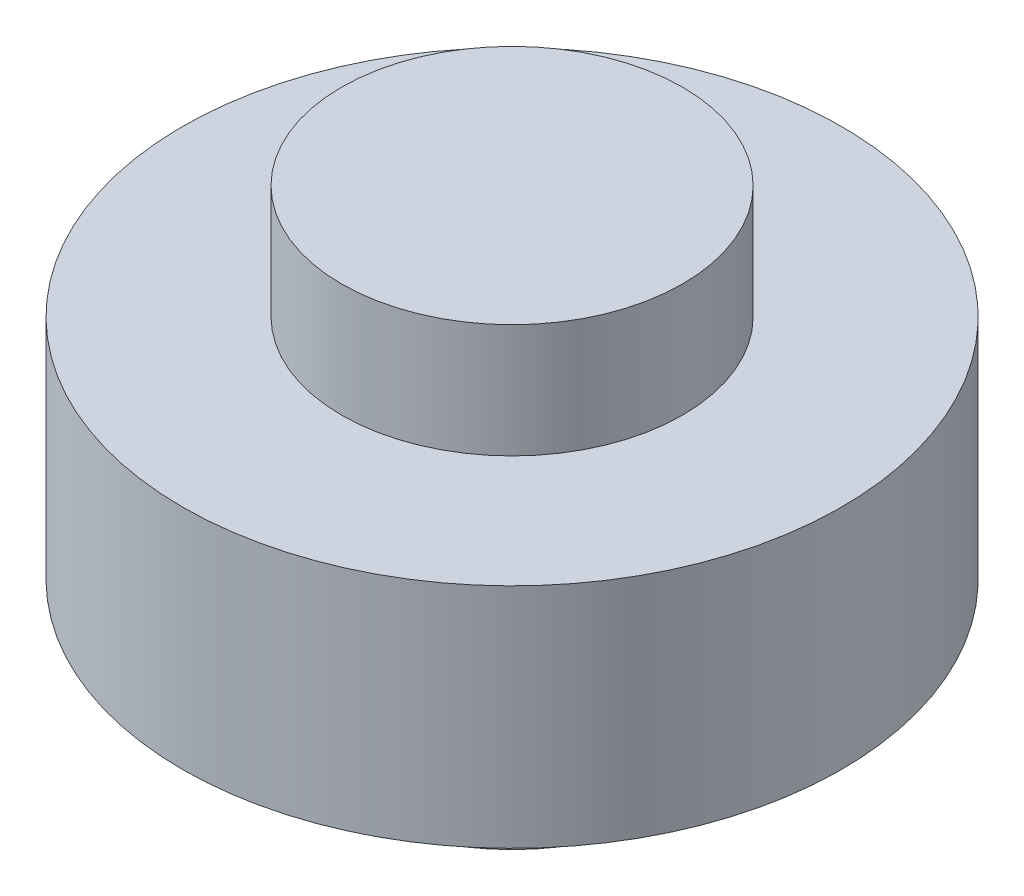
ISO-10303-21;
HEADER;
FILE_DESCRIPTION(('STEP AP214'),'2;1');
FILE_NAME('part.step','',(''),(''),'','','');
FILE_SCHEMA(('AUTOMOTIVE_DESIGN { 1 0 10303 214 1 1 1 1 }'));
ENDSEC;
DATA;
#1=APPLICATION_CONTEXT('core data for automotive mechanical design processes');
#2=APPLICATION_PROTOCOL_DEFINITION('international standard','automotive_design',2000,#1);
#3=PRODUCT_CONTEXT('',#1,'mechanical');
#4=PRODUCT('Part','Part','',(#3));
#5=PRODUCT_RELATED_PRODUCT_CATEGORY('part','',(#4));
#6=PRODUCT_DEFINITION_FORMATION('','',#4);
#7=PRODUCT_DEFINITION_CONTEXT('part definition',#1,'design');
#8=PRODUCT_DEFINITION('design','',#6,#7);
#9=PRODUCT_DEFINITION_SHAPE('','',#8);
#10=(LENGTH_UNIT() NAMED_UNIT(*) SI_UNIT(.MILLI.,.METRE.));
#11=(NAMED_UNIT(*) PLANE_ANGLE_UNIT() SI_UNIT($,.RADIAN.));
#12=(NAMED_UNIT(*) SI_UNIT($,.STERADIAN.) SOLID_ANGLE_UNIT());
#13=UNCERTAINTY_MEASURE_WITH_UNIT(LENGTH_MEASURE(1.E-05),#10,'distance_accuracy_value','');
#14=(GEOMETRIC_REPRESENTATION_CONTEXT(3) GLOBAL_UNCERTAINTY_ASSIGNED_CONTEXT((#13)) GLOBAL_UNIT_ASSIGNED_CONTEXT((#10,
#11,#12)) REPRESENTATION_CONTEXT('',''));
#15=CARTESIAN_POINT('',(0.,0.,0.));
#16=DIRECTION('',(0.,0.,1.));
#17=DIRECTION('',(1.,0.,0.));
#18=AXIS2_PLACEMENT_3D('',#15,#16,#17);
#19=CARTESIAN_POINT('',(0.,101.6,0.));
#20=DIRECTION('',(0.,1.,0.));
#21=DIRECTION('',(0.,0.,1.));
#22=AXIS2_PLACEMENT_3D('',#19,#20,#21);
#23=PLANE('',#22);
#24=CARTESIAN_POINT('',(0.,101.6,0.));
#25=DIRECTION('',(0.,1.,0.));
#26=DIRECTION('',(0.,0.,1.));
#27=AXIS2_PLACEMENT_3D('',#24,#25,#26);
#28=CIRCLE('',#27,76.2);
#29=CARTESIAN_POINT('',(0.,101.6,76.2));
#30=VERTEX_POINT('',#29);
#31=EDGE_CURVE('E10',#30,#30,#28,.T.);
#32=ORIENTED_EDGE('',*,*,#31,.T.);
#33=EDGE_LOOP('',(#32));
#34=FACE_BOUND('',#33,.T.);
#35=ADVANCED_FACE('F34',(#34),#23,.T.);
#36=CARTESIAN_POINT('',(0.,101.6,0.));
#37=DIRECTION('',(0.,1.,0.));
#38=DIRECTION('',(0.,0.,1.));
#39=AXIS2_PLACEMENT_3D('',#36,#37,#38);
#40=CYLINDRICAL_SURFACE('',#39,76.1999999999999);
#41=CARTESIAN_POINT('',(0.,50.8,0.));
#42=DIRECTION('',(0.,1.,0.));
#43=DIRECTION('',(0.,0.,1.));
#44=AXIS2_PLACEMENT_3D('',#41,#42,#43);
#45=CIRCLE('',#44,76.1999999999999);
#46=CARTESIAN_POINT('',(0.,50.8,76.1999999999999));
#47=VERTEX_POINT('',#46);
#48=EDGE_CURVE('E40',#47,#47,#45,.T.);
#49=ORIENTED_EDGE('',*,*,#48,.T.);
#50=EDGE_LOOP('',(#49));
#51=FACE_BOUND('',#50,.T.);
#52=ORIENTED_EDGE('',*,*,#31,.F.);
#53=EDGE_LOOP('',(#52));
#54=FACE_BOUND('',#53,.T.);
#55=ADVANCED_FACE('F72',(#51,#54),#40,.T.);
#56=CARTESIAN_POINT('',(-76.1999999999998,50.8,0.));
#57=DIRECTION('',(0.,1.,0.));
#58=DIRECTION('',(0.,0.,1.));
#59=AXIS2_PLACEMENT_3D('',#56,#57,#58);
#60=PLANE('',#59);
#61=CARTESIAN_POINT('',(0.,50.8,0.));
#62=DIRECTION('',(0.,1.,0.));
#63=DIRECTION('',(0.,0.,1.));
#64=AXIS2_PLACEMENT_3D('',#61,#62,#63);
#65=CIRCLE('',#64,147.32);
#66=CARTESIAN_POINT('',(0.,50.8,147.32));
#67=VERTEX_POINT('',#66);
#68=EDGE_CURVE('E44',#67,#67,#65,.T.);
#69=ORIENTED_EDGE('',*,*,#68,.T.);
#70=EDGE_LOOP('',(#69));
#71=FACE_BOUND('',#70,.T.);
#72=ORIENTED_EDGE('',*,*,#48,.F.);
#73=EDGE_LOOP('',(#72));
#74=FACE_BOUND('',#73,.T.);
#75=ADVANCED_FACE('F76',(#71,#74),#60,.T.);
#76=CARTESIAN_POINT('',(0.,101.6,0.));
#77=DIRECTION('',(0.,1.,0.));
#78=DIRECTION('',(0.,0.,1.));
#79=AXIS2_PLACEMENT_3D('',#76,#77,#78);
#80=CYLINDRICAL_SURFACE('',#79,147.32);
#81=CARTESIAN_POINT('',(0.,-50.8,0.));
#82=DIRECTION('',(0.,1.,0.));
#83=DIRECTION('',(0.,0.,1.));
#84=AXIS2_PLACEMENT_3D('',#81,#82,#83);
#85=CIRCLE('',#84,147.32);
#86=CARTESIAN_POINT('',(0.,-50.8,147.32));
#87=VERTEX_POINT('',#86);
#88=EDGE_CURVE('E48',#87,#87,#85,.T.);
#89=ORIENTED_EDGE('',*,*,#88,.T.);
#90=EDGE_LOOP('',(#89));
#91=FACE_BOUND('',#90,.T.);
#92=ORIENTED_EDGE('',*,*,#68,.F.);
#93=EDGE_LOOP('',(#92));
#94=FACE_BOUND('',#93,.T.);
#95=ADVANCED_FACE('F80',(#91,#94),#80,.T.);
#96=CARTESIAN_POINT('',(-147.32,-50.8,0.));
#97=DIRECTION('',(0.,-1.,0.));
#98=DIRECTION('',(0.,0.,-1.));
#99=AXIS2_PLACEMENT_3D('',#96,#97,#98);
#100=PLANE('',#99);
#101=CARTESIAN_POINT('',(0.,-50.8,0.));
#102=DIRECTION('',(0.,1.,0.));
#103=DIRECTION('',(0.,0.,1.));
#104=AXIS2_PLACEMENT_3D('',#101,#102,#103);
#105=CIRCLE('',#104,76.1999999999999);
#106=CARTESIAN_POINT('',(0.,-50.8,76.1999999999999));
#107=VERTEX_POINT('',#106);
#108=EDGE_CURVE('E53',#107,#107,#105,.T.);
#109=ORIENTED_EDGE('',*,*,#108,.T.);
#110=EDGE_LOOP('',(#109));
#111=FACE_BOUND('',#110,.T.);
#112=ORIENTED_EDGE('',*,*,#88,.F.);
#113=EDGE_LOOP('',(#112));
#114=FACE_BOUND('',#113,.T.);
#115=ADVANCED_FACE('F69',(#111,#114),#100,.T.);
#116=CARTESIAN_POINT('',(0.,101.6,0.));
#117=DIRECTION('',(0.,1.,0.));
#118=DIRECTION('',(0.,0.,1.));
#119=AXIS2_PLACEMENT_3D('',#116,#117,#118);
#120=CYLINDRICAL_SURFACE('',#119,76.1999999999999);
#121=CARTESIAN_POINT('',(0.,-101.6,0.));
#122=DIRECTION('',(0.,1.,0.));
#123=DIRECTION('',(0.,0.,1.));
#124=AXIS2_PLACEMENT_3D('',#121,#122,#123);
#125=CIRCLE('',#124,76.1999999999999);
#126=CARTESIAN_POINT('',(0.,-101.6,76.1999999999999));
#127=VERTEX_POINT('',#126);
#128=EDGE_CURVE('E56',#127,#127,#125,.T.);
#129=ORIENTED_EDGE('',*,*,#128,.T.);
#130=EDGE_LOOP('',(#129));
#131=FACE_BOUND('',#130,.T.);
#132=ORIENTED_EDGE('',*,*,#108,.F.);
#133=EDGE_LOOP('',(#132));
#134=FACE_BOUND('',#133,.T.);
#135=ADVANCED_FACE('F60',(#131,#134),#120,.T.);
#136=CARTESIAN_POINT('',(-76.1999999999998,-101.6,0.));
#137=DIRECTION('',(0.,-1.,0.));
#138=DIRECTION('',(0.,0.,-1.));
#139=AXIS2_PLACEMENT_3D('',#136,#137,#138);
#140=PLANE('',#139);
#141=ORIENTED_EDGE('',*,*,#128,.F.);
#142=EDGE_LOOP('',(#141));
#143=FACE_BOUND('',#142,.T.);
#144=ADVANCED_FACE('F63',(#143),#140,.T.);
#145=CLOSED_SHELL('',(#35,#55,#75,#95,#115,#135,#144));
#146=MANIFOLD_SOLID_BREP('B2',#145);
#147=ADVANCED_BREP_SHAPE_REPRESENTATION('',(#18,#146),#14);
#148=SHAPE_DEFINITION_REPRESENTATION(#9,#147);
ENDSEC;
END-ISO-10303-21;
